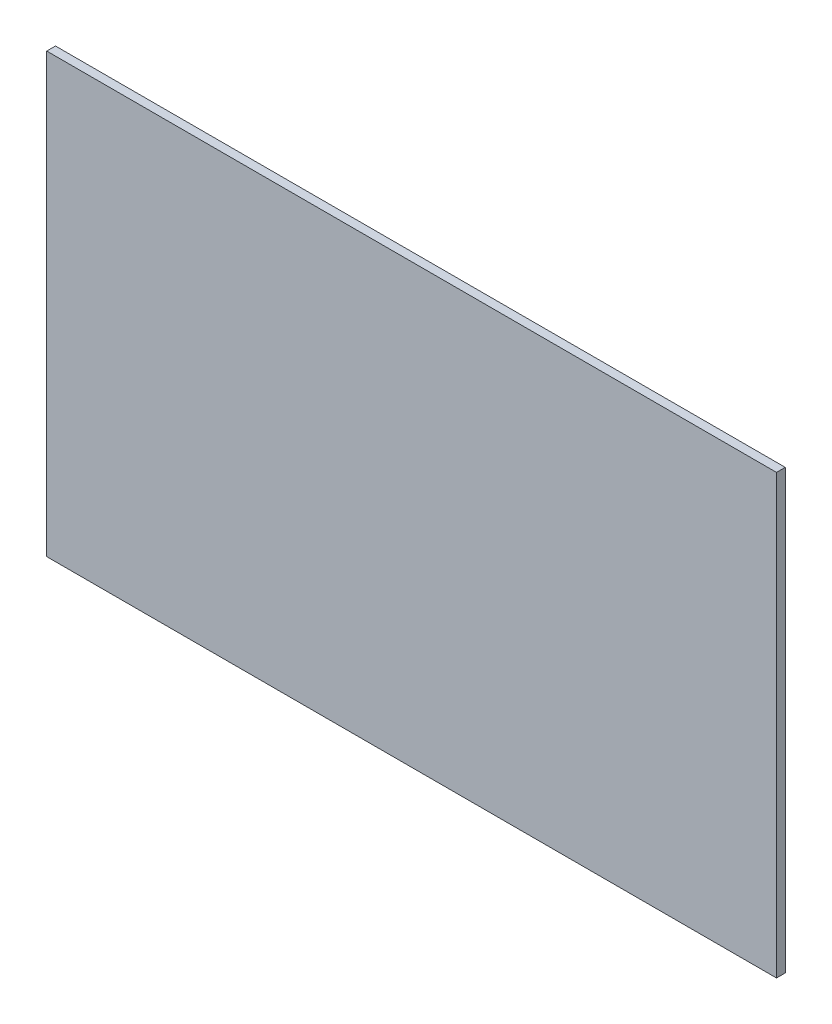
ISO-10303-21;
HEADER;
FILE_DESCRIPTION(('STEP AP214'),'2;1');
FILE_NAME('part.step','',(''),(''),'','','');
FILE_SCHEMA(('AUTOMOTIVE_DESIGN { 1 0 10303 214 1 1 1 1 }'));
ENDSEC;
DATA;
#1=APPLICATION_CONTEXT('core data for automotive mechanical design processes');
#2=APPLICATION_PROTOCOL_DEFINITION('international standard','automotive_design',2000,#1);
#3=PRODUCT_CONTEXT('',#1,'mechanical');
#4=PRODUCT('Part','Part','',(#3));
#5=PRODUCT_RELATED_PRODUCT_CATEGORY('part','',(#4));
#6=PRODUCT_DEFINITION_FORMATION('','',#4);
#7=PRODUCT_DEFINITION_CONTEXT('part definition',#1,'design');
#8=PRODUCT_DEFINITION('design','',#6,#7);
#9=PRODUCT_DEFINITION_SHAPE('','',#8);
#10=(LENGTH_UNIT() NAMED_UNIT(*) SI_UNIT(.MILLI.,.METRE.));
#11=(NAMED_UNIT(*) PLANE_ANGLE_UNIT() SI_UNIT($,.RADIAN.));
#12=(NAMED_UNIT(*) SI_UNIT($,.STERADIAN.) SOLID_ANGLE_UNIT());
#13=UNCERTAINTY_MEASURE_WITH_UNIT(LENGTH_MEASURE(1.E-05),#10,'distance_accuracy_value','');
#14=(GEOMETRIC_REPRESENTATION_CONTEXT(3) GLOBAL_UNCERTAINTY_ASSIGNED_CONTEXT((#13)) GLOBAL_UNIT_ASSIGNED_CONTEXT((#10,
#11,#12)) REPRESENTATION_CONTEXT('',''));
#15=CARTESIAN_POINT('',(0.,0.,0.));
#16=DIRECTION('',(0.,0.,1.));
#17=DIRECTION('',(1.,0.,0.));
#18=AXIS2_PLACEMENT_3D('',#15,#16,#17);
#19=CARTESIAN_POINT('',(63.5,-38.1,1.524));
#20=DIRECTION('',(-1.,0.,0.));
#21=DIRECTION('',(0.,0.,1.));
#22=AXIS2_PLACEMENT_3D('',#19,#20,#21);
#23=PLANE('',#22);
#24=DIRECTION('',(0.,1.,0.));
#25=VECTOR('',#24,1.);
#26=CARTESIAN_POINT('',(63.5,-38.1,0.));
#27=LINE('',#26,#25);
#28=CARTESIAN_POINT('',(63.5,-38.1,0.));
#29=VERTEX_POINT('',#28);
#30=CARTESIAN_POINT('',(63.5,38.1,0.));
#31=VERTEX_POINT('',#30);
#32=EDGE_CURVE('E96',#29,#31,#27,.T.);
#33=ORIENTED_EDGE('',*,*,#32,.T.);
#34=DIRECTION('',(0.,0.,-1.));
#35=VECTOR('',#34,1.);
#36=CARTESIAN_POINT('',(63.5,38.1,1.524));
#37=LINE('',#36,#35);
#38=CARTESIAN_POINT('',(63.5,38.1,1.524));
#39=VERTEX_POINT('',#38);
#40=EDGE_CURVE('E11',#39,#31,#37,.T.);
#41=ORIENTED_EDGE('',*,*,#40,.F.);
#42=DIRECTION('',(0.,1.,0.));
#43=VECTOR('',#42,1.);
#44=CARTESIAN_POINT('',(63.5,-38.1,1.524));
#45=LINE('',#44,#43);
#46=CARTESIAN_POINT('',(63.5,-38.1,1.524));
#47=VERTEX_POINT('',#46);
#48=EDGE_CURVE('E84',#47,#39,#45,.T.);
#49=ORIENTED_EDGE('',*,*,#48,.F.);
#50=DIRECTION('',(0.,0.,-1.));
#51=VECTOR('',#50,1.);
#52=CARTESIAN_POINT('',(63.5,-38.1,1.524));
#53=LINE('',#52,#51);
#54=EDGE_CURVE('E92',#47,#29,#53,.T.);
#55=ORIENTED_EDGE('',*,*,#54,.T.);
#56=EDGE_LOOP('',(#33,#41,#49,#55));
#57=FACE_BOUND('',#56,.T.);
#58=ADVANCED_FACE('F33',(#57),#23,.F.);
#59=CARTESIAN_POINT('',(-63.5,38.1,1.524));
#60=DIRECTION('',(0.,-1.,0.));
#61=DIRECTION('',(0.,0.,-1.));
#62=AXIS2_PLACEMENT_3D('',#59,#60,#61);
#63=PLANE('',#62);
#64=DIRECTION('',(-1.,0.,0.));
#65=VECTOR('',#64,1.);
#66=CARTESIAN_POINT('',(-63.5,38.1,0.));
#67=LINE('',#66,#65);
#68=CARTESIAN_POINT('',(-63.5,38.1,0.));
#69=VERTEX_POINT('',#68);
#70=EDGE_CURVE('E88',#31,#69,#67,.T.);
#71=ORIENTED_EDGE('',*,*,#70,.T.);
#72=DIRECTION('',(0.,0.,-1.));
#73=VECTOR('',#72,1.);
#74=CARTESIAN_POINT('',(-63.5,38.1,1.524));
#75=LINE('',#74,#73);
#76=CARTESIAN_POINT('',(-63.5,38.1,1.524));
#77=VERTEX_POINT('',#76);
#78=EDGE_CURVE('E41',#77,#69,#75,.T.);
#79=ORIENTED_EDGE('',*,*,#78,.F.);
#80=DIRECTION('',(-1.,0.,0.));
#81=VECTOR('',#80,1.);
#82=CARTESIAN_POINT('',(-63.5,38.1,1.524));
#83=LINE('',#82,#81);
#84=EDGE_CURVE('E79',#39,#77,#83,.T.);
#85=ORIENTED_EDGE('',*,*,#84,.F.);
#86=ORIENTED_EDGE('',*,*,#40,.T.);
#87=EDGE_LOOP('',(#71,#79,#85,#86));
#88=FACE_BOUND('',#87,.T.);
#89=ADVANCED_FACE('F87',(#88),#63,.F.);
#90=CARTESIAN_POINT('',(-63.5,-38.1,1.524));
#91=DIRECTION('',(1.,0.,0.));
#92=DIRECTION('',(0.,0.,-1.));
#93=AXIS2_PLACEMENT_3D('',#90,#91,#92);
#94=PLANE('',#93);
#95=DIRECTION('',(0.,-1.,0.));
#96=VECTOR('',#95,1.);
#97=CARTESIAN_POINT('',(-63.5,-38.1,0.));
#98=LINE('',#97,#96);
#99=CARTESIAN_POINT('',(-63.5,-38.1,0.));
#100=VERTEX_POINT('',#99);
#101=EDGE_CURVE('E66',#69,#100,#98,.T.);
#102=ORIENTED_EDGE('',*,*,#101,.T.);
#103=DIRECTION('',(0.,0.,-1.));
#104=VECTOR('',#103,1.);
#105=CARTESIAN_POINT('',(-63.5,-38.1,1.524));
#106=LINE('',#105,#104);
#107=CARTESIAN_POINT('',(-63.5,-38.1,1.524));
#108=VERTEX_POINT('',#107);
#109=EDGE_CURVE('E89',#108,#100,#106,.T.);
#110=ORIENTED_EDGE('',*,*,#109,.F.);
#111=DIRECTION('',(0.,-1.,0.));
#112=VECTOR('',#111,1.);
#113=CARTESIAN_POINT('',(-63.5,-38.1,1.524));
#114=LINE('',#113,#112);
#115=EDGE_CURVE('E82',#77,#108,#114,.T.);
#116=ORIENTED_EDGE('',*,*,#115,.F.);
#117=ORIENTED_EDGE('',*,*,#78,.T.);
#118=EDGE_LOOP('',(#102,#110,#116,#117));
#119=FACE_BOUND('',#118,.T.);
#120=ADVANCED_FACE('F90',(#119),#94,.F.);
#121=CARTESIAN_POINT('',(-63.5,-38.1,1.524));
#122=DIRECTION('',(0.,1.,0.));
#123=DIRECTION('',(0.,0.,1.));
#124=AXIS2_PLACEMENT_3D('',#121,#122,#123);
#125=PLANE('',#124);
#126=DIRECTION('',(1.,0.,0.));
#127=VECTOR('',#126,1.);
#128=CARTESIAN_POINT('',(-63.5,-38.1,0.));
#129=LINE('',#128,#127);
#130=EDGE_CURVE('E72',#100,#29,#129,.T.);
#131=ORIENTED_EDGE('',*,*,#130,.T.);
#132=ORIENTED_EDGE('',*,*,#54,.F.);
#133=DIRECTION('',(1.,0.,0.));
#134=VECTOR('',#133,1.);
#135=CARTESIAN_POINT('',(-63.5,-38.1,1.524));
#136=LINE('',#135,#134);
#137=EDGE_CURVE('E49',#108,#47,#136,.T.);
#138=ORIENTED_EDGE('',*,*,#137,.F.);
#139=ORIENTED_EDGE('',*,*,#109,.T.);
#140=EDGE_LOOP('',(#131,#132,#138,#139));
#141=FACE_BOUND('',#140,.T.);
#142=ADVANCED_FACE('F103',(#141),#125,.F.);
#143=CARTESIAN_POINT('',(0.,0.,1.524));
#144=DIRECTION('',(0.,0.,-1.));
#145=DIRECTION('',(-1.,0.,0.));
#146=AXIS2_PLACEMENT_3D('',#143,#144,#145);
#147=PLANE('',#146);
#148=ORIENTED_EDGE('',*,*,#48,.T.);
#149=ORIENTED_EDGE('',*,*,#84,.T.);
#150=ORIENTED_EDGE('',*,*,#115,.T.);
#151=ORIENTED_EDGE('',*,*,#137,.T.);
#152=EDGE_LOOP('',(#148,#149,#150,#151));
#153=FACE_BOUND('',#152,.T.);
#154=ADVANCED_FACE('F80',(#153),#147,.F.);
#155=CARTESIAN_POINT('',(0.,0.,0.));
#156=DIRECTION('',(0.,0.,-1.));
#157=DIRECTION('',(-1.,0.,0.));
#158=AXIS2_PLACEMENT_3D('',#155,#156,#157);
#159=PLANE('',#158);
#160=ORIENTED_EDGE('',*,*,#32,.F.);
#161=ORIENTED_EDGE('',*,*,#130,.F.);
#162=ORIENTED_EDGE('',*,*,#101,.F.);
#163=ORIENTED_EDGE('',*,*,#70,.F.);
#164=EDGE_LOOP('',(#160,#161,#162,#163));
#165=FACE_BOUND('',#164,.T.);
#166=ADVANCED_FACE('F106',(#165),#159,.T.);
#167=CLOSED_SHELL('',(#58,#89,#120,#142,#154,#166));
#168=MANIFOLD_SOLID_BREP('B2',#167);
#169=ADVANCED_BREP_SHAPE_REPRESENTATION('',(#18,#168),#14);
#170=SHAPE_DEFINITION_REPRESENTATION(#9,#169);
ENDSEC;
END-ISO-10303-21;
